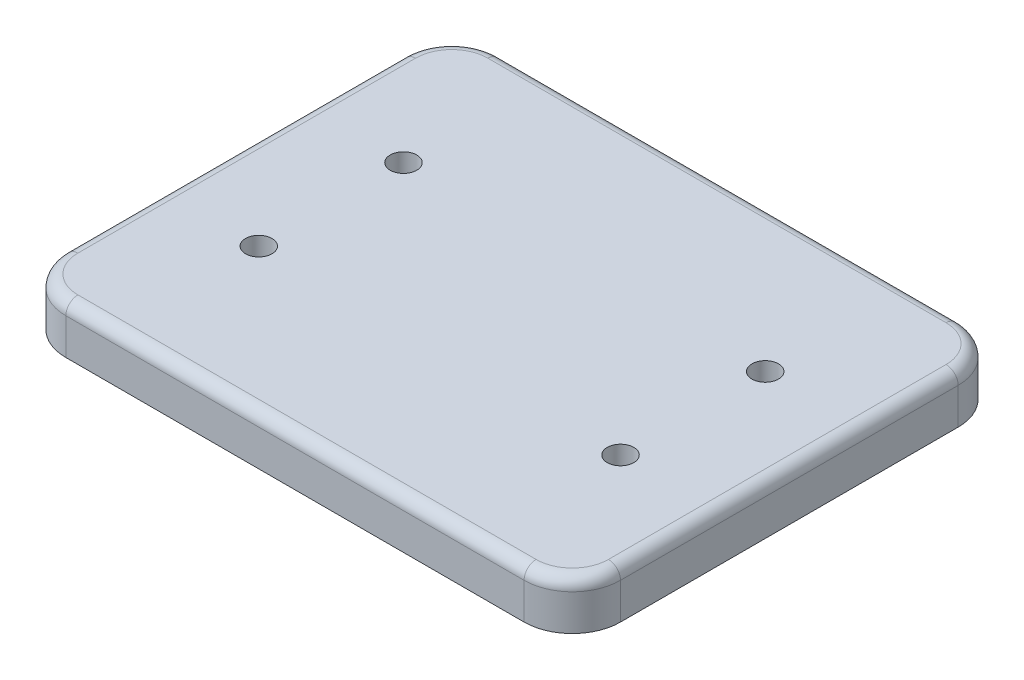
ISO-10303-21;
HEADER;
FILE_DESCRIPTION(('STEP AP214'),'2;1');
FILE_NAME('part.step','',(''),(''),'','','');
FILE_SCHEMA(('AUTOMOTIVE_DESIGN { 1 0 10303 214 1 1 1 1 }'));
ENDSEC;
DATA;
#1=APPLICATION_CONTEXT('core data for automotive mechanical design processes');
#2=APPLICATION_PROTOCOL_DEFINITION('international standard','automotive_design',2000,#1);
#3=PRODUCT_CONTEXT('',#1,'mechanical');
#4=PRODUCT('Part','Part','',(#3));
#5=PRODUCT_RELATED_PRODUCT_CATEGORY('part','',(#4));
#6=PRODUCT_DEFINITION_FORMATION('','',#4);
#7=PRODUCT_DEFINITION_CONTEXT('part definition',#1,'design');
#8=PRODUCT_DEFINITION('design','',#6,#7);
#9=PRODUCT_DEFINITION_SHAPE('','',#8);
#10=(LENGTH_UNIT() NAMED_UNIT(*) SI_UNIT(.MILLI.,.METRE.));
#11=(NAMED_UNIT(*) PLANE_ANGLE_UNIT() SI_UNIT($,.RADIAN.));
#12=(NAMED_UNIT(*) SI_UNIT($,.STERADIAN.) SOLID_ANGLE_UNIT());
#13=UNCERTAINTY_MEASURE_WITH_UNIT(LENGTH_MEASURE(1.E-05),#10,'distance_accuracy_value','');
#14=(GEOMETRIC_REPRESENTATION_CONTEXT(3) GLOBAL_UNCERTAINTY_ASSIGNED_CONTEXT((#13)) GLOBAL_UNIT_ASSIGNED_CONTEXT((#10,
#11,#12)) REPRESENTATION_CONTEXT('',''));
#15=CARTESIAN_POINT('',(0.,0.,0.));
#16=DIRECTION('',(0.,0.,1.));
#17=DIRECTION('',(1.,0.,0.));
#18=AXIS2_PLACEMENT_3D('',#15,#16,#17);
#19=CARTESIAN_POINT('',(75.,0.,30.));
#20=DIRECTION('',(0.,1.,0.));
#21=DIRECTION('',(0.,0.,1.));
#22=AXIS2_PLACEMENT_3D('',#19,#20,#21);
#23=CYLINDRICAL_SURFACE('',#22,5.5);
#24=CARTESIAN_POINT('',(75.,20.,30.));
#25=DIRECTION('',(0.,-1.,0.));
#26=DIRECTION('',(0.,0.,-1.));
#27=AXIS2_PLACEMENT_3D('',#24,#25,#26);
#28=CIRCLE('',#27,5.5);
#29=CARTESIAN_POINT('',(75.,20.,24.5));
#30=VERTEX_POINT('',#29);
#31=EDGE_CURVE('E241',#30,#30,#28,.T.);
#32=ORIENTED_EDGE('',*,*,#31,.F.);
#33=EDGE_LOOP('',(#32));
#34=FACE_BOUND('',#33,.T.);
#35=CARTESIAN_POINT('',(75.,11.,30.));
#36=DIRECTION('',(0.,-1.,0.));
#37=DIRECTION('',(0.,0.,-1.));
#38=AXIS2_PLACEMENT_3D('',#35,#36,#37);
#39=CIRCLE('',#38,5.5);
#40=CARTESIAN_POINT('',(75.,11.,24.5));
#41=VERTEX_POINT('',#40);
#42=EDGE_CURVE('E37',#41,#41,#39,.T.);
#43=ORIENTED_EDGE('',*,*,#42,.T.);
#44=EDGE_LOOP('',(#43));
#45=FACE_BOUND('',#44,.T.);
#46=ADVANCED_FACE('F33',(#34,#45),#23,.F.);
#47=CARTESIAN_POINT('',(-75.,0.,30.));
#48=DIRECTION('',(0.,1.,0.));
#49=DIRECTION('',(0.,0.,1.));
#50=AXIS2_PLACEMENT_3D('',#47,#48,#49);
#51=CYLINDRICAL_SURFACE('',#50,5.5);
#52=CARTESIAN_POINT('',(-75.,20.,30.));
#53=DIRECTION('',(0.,-1.,0.));
#54=DIRECTION('',(0.,0.,-1.));
#55=AXIS2_PLACEMENT_3D('',#52,#53,#54);
#56=CIRCLE('',#55,5.5);
#57=CARTESIAN_POINT('',(-75.,20.,24.5));
#58=VERTEX_POINT('',#57);
#59=EDGE_CURVE('E256',#58,#58,#56,.T.);
#60=ORIENTED_EDGE('',*,*,#59,.F.);
#61=EDGE_LOOP('',(#60));
#62=FACE_BOUND('',#61,.T.);
#63=CARTESIAN_POINT('',(-75.,11.,30.));
#64=DIRECTION('',(0.,-1.,0.));
#65=DIRECTION('',(0.,0.,-1.));
#66=AXIS2_PLACEMENT_3D('',#63,#64,#65);
#67=CIRCLE('',#66,5.5);
#68=CARTESIAN_POINT('',(-75.,11.,24.5));
#69=VERTEX_POINT('',#68);
#70=EDGE_CURVE('E235',#69,#69,#67,.T.);
#71=ORIENTED_EDGE('',*,*,#70,.T.);
#72=EDGE_LOOP('',(#71));
#73=FACE_BOUND('',#72,.T.);
#74=ADVANCED_FACE('F345',(#62,#73),#51,.F.);
#75=CARTESIAN_POINT('',(75.,0.,-30.));
#76=DIRECTION('',(0.,1.,0.));
#77=DIRECTION('',(0.,0.,1.));
#78=AXIS2_PLACEMENT_3D('',#75,#76,#77);
#79=CYLINDRICAL_SURFACE('',#78,5.5);
#80=CARTESIAN_POINT('',(75.,20.,-30.));
#81=DIRECTION('',(0.,1.,0.));
#82=DIRECTION('',(0.,0.,1.));
#83=AXIS2_PLACEMENT_3D('',#80,#81,#82);
#84=CIRCLE('',#83,5.5);
#85=CARTESIAN_POINT('',(75.,20.,-24.5));
#86=VERTEX_POINT('',#85);
#87=EDGE_CURVE('E151',#86,#86,#84,.T.);
#88=ORIENTED_EDGE('',*,*,#87,.T.);
#89=EDGE_LOOP('',(#88));
#90=FACE_BOUND('',#89,.T.);
#91=CARTESIAN_POINT('',(75.,11.,-30.));
#92=DIRECTION('',(0.,-1.,0.));
#93=DIRECTION('',(0.,0.,-1.));
#94=AXIS2_PLACEMENT_3D('',#91,#92,#93);
#95=CIRCLE('',#94,5.5);
#96=CARTESIAN_POINT('',(75.,11.,-35.5));
#97=VERTEX_POINT('',#96);
#98=EDGE_CURVE('E232',#97,#97,#95,.F.);
#99=ORIENTED_EDGE('',*,*,#98,.F.);
#100=EDGE_LOOP('',(#99));
#101=FACE_BOUND('',#100,.T.);
#102=ADVANCED_FACE('F277',(#90,#101),#79,.F.);
#103=CARTESIAN_POINT('',(-75.,0.,-30.));
#104=DIRECTION('',(0.,1.,0.));
#105=DIRECTION('',(0.,0.,1.));
#106=AXIS2_PLACEMENT_3D('',#103,#104,#105);
#107=CYLINDRICAL_SURFACE('',#106,5.5);
#108=CARTESIAN_POINT('',(-75.,20.,-30.));
#109=DIRECTION('',(0.,1.,0.));
#110=DIRECTION('',(0.,0.,1.));
#111=AXIS2_PLACEMENT_3D('',#108,#109,#110);
#112=CIRCLE('',#111,5.5);
#113=CARTESIAN_POINT('',(-75.,20.,-24.5));
#114=VERTEX_POINT('',#113);
#115=EDGE_CURVE('E213',#114,#114,#112,.T.);
#116=ORIENTED_EDGE('',*,*,#115,.T.);
#117=EDGE_LOOP('',(#116));
#118=FACE_BOUND('',#117,.T.);
#119=CARTESIAN_POINT('',(-75.,11.,-30.));
#120=DIRECTION('',(0.,-1.,0.));
#121=DIRECTION('',(0.,0.,-1.));
#122=AXIS2_PLACEMENT_3D('',#119,#120,#121);
#123=CIRCLE('',#122,5.5);
#124=CARTESIAN_POINT('',(-75.,11.,-35.5));
#125=VERTEX_POINT('',#124);
#126=EDGE_CURVE('E229',#125,#125,#123,.F.);
#127=ORIENTED_EDGE('',*,*,#126,.F.);
#128=EDGE_LOOP('',(#127));
#129=FACE_BOUND('',#128,.T.);
#130=ADVANCED_FACE('F374',(#118,#129),#107,.F.);
#131=CARTESIAN_POINT('',(-94.9999999999999,20.,70.));
#132=DIRECTION('',(0.,-1.,0.));
#133=DIRECTION('',(0.,0.,-1.));
#134=AXIS2_PLACEMENT_3D('',#131,#132,#133);
#135=CYLINDRICAL_SURFACE('',#134,20.);
#136=DIRECTION('',(0.,-1.,0.));
#137=VECTOR('',#136,1.);
#138=CARTESIAN_POINT('',(-94.9999999999998,20.,90.));
#139=LINE('',#138,#137);
#140=CARTESIAN_POINT('',(-94.9999999999998,15.,90.));
#141=VERTEX_POINT('',#140);
#142=CARTESIAN_POINT('',(-94.9999999999998,0.,90.));
#143=VERTEX_POINT('',#142);
#144=EDGE_CURVE('E121',#141,#143,#139,.T.);
#145=ORIENTED_EDGE('',*,*,#144,.F.);
#146=CARTESIAN_POINT('',(-94.9999999999999,15.,70.));
#147=DIRECTION('',(0.,-1.,0.));
#148=DIRECTION('',(0.,0.,-1.));
#149=AXIS2_PLACEMENT_3D('',#146,#147,#148);
#150=CIRCLE('',#149,20.);
#151=CARTESIAN_POINT('',(-115.,15.,69.9999999999999));
#152=VERTEX_POINT('',#151);
#153=EDGE_CURVE('E11',#141,#152,#150,.T.);
#154=ORIENTED_EDGE('',*,*,#153,.T.);
#155=DIRECTION('',(0.,-1.,0.));
#156=VECTOR('',#155,1.);
#157=CARTESIAN_POINT('',(-115.,20.,69.9999999999999));
#158=LINE('',#157,#156);
#159=CARTESIAN_POINT('',(-115.,0.,69.9999999999999));
#160=VERTEX_POINT('',#159);
#161=EDGE_CURVE('E143',#152,#160,#158,.T.);
#162=ORIENTED_EDGE('',*,*,#161,.T.);
#163=CARTESIAN_POINT('',(-94.9999999999999,0.,70.));
#164=DIRECTION('',(0.,1.,0.));
#165=DIRECTION('',(0.,0.,-1.));
#166=AXIS2_PLACEMENT_3D('',#163,#164,#165);
#167=CIRCLE('',#166,20.);
#168=EDGE_CURVE('E136',#160,#143,#167,.T.);
#169=ORIENTED_EDGE('',*,*,#168,.T.);
#170=EDGE_LOOP('',(#145,#154,#162,#169));
#171=FACE_BOUND('',#170,.T.);
#172=ADVANCED_FACE('F141',(#171),#135,.T.);
#173=CARTESIAN_POINT('',(94.9999999999999,20.,90.));
#174=DIRECTION('',(0.,0.,-1.));
#175=DIRECTION('',(-1.,0.,0.));
#176=AXIS2_PLACEMENT_3D('',#173,#174,#175);
#177=PLANE('',#176);
#178=DIRECTION('',(0.,-1.,0.));
#179=VECTOR('',#178,1.);
#180=CARTESIAN_POINT('',(94.9999999999999,20.,90.));
#181=LINE('',#180,#179);
#182=CARTESIAN_POINT('',(94.9999999999999,15.,90.));
#183=VERTEX_POINT('',#182);
#184=CARTESIAN_POINT('',(94.9999999999999,0.,90.));
#185=VERTEX_POINT('',#184);
#186=EDGE_CURVE('E130',#183,#185,#181,.T.);
#187=ORIENTED_EDGE('',*,*,#186,.F.);
#188=DIRECTION('',(1.,0.,0.));
#189=VECTOR('',#188,1.);
#190=CARTESIAN_POINT('',(94.9999999999999,15.,90.));
#191=LINE('',#190,#189);
#192=EDGE_CURVE('E42',#183,#141,#191,.F.);
#193=ORIENTED_EDGE('',*,*,#192,.T.);
#194=ORIENTED_EDGE('',*,*,#144,.T.);
#195=DIRECTION('',(1.,0.,0.));
#196=VECTOR('',#195,1.);
#197=CARTESIAN_POINT('',(94.9999999999999,0.,90.));
#198=LINE('',#197,#196);
#199=EDGE_CURVE('E124',#143,#185,#198,.T.);
#200=ORIENTED_EDGE('',*,*,#199,.T.);
#201=EDGE_LOOP('',(#187,#193,#194,#200));
#202=FACE_BOUND('',#201,.T.);
#203=ADVANCED_FACE('F123',(#202),#177,.F.);
#204=CARTESIAN_POINT('',(95.0000000000001,20.,70.));
#205=DIRECTION('',(0.,-1.,0.));
#206=DIRECTION('',(0.,0.,-1.));
#207=AXIS2_PLACEMENT_3D('',#204,#205,#206);
#208=CYLINDRICAL_SURFACE('',#207,20.);
#209=DIRECTION('',(0.,-1.,0.));
#210=VECTOR('',#209,1.);
#211=CARTESIAN_POINT('',(115.,20.,69.9999999999999));
#212=LINE('',#211,#210);
#213=CARTESIAN_POINT('',(115.,15.,69.9999999999999));
#214=VERTEX_POINT('',#213);
#215=CARTESIAN_POINT('',(115.,0.,69.9999999999999));
#216=VERTEX_POINT('',#215);
#217=EDGE_CURVE('E178',#214,#216,#212,.T.);
#218=ORIENTED_EDGE('',*,*,#217,.F.);
#219=CARTESIAN_POINT('',(95.0000000000001,15.,70.));
#220=DIRECTION('',(0.,-1.,0.));
#221=DIRECTION('',(0.,0.,-1.));
#222=AXIS2_PLACEMENT_3D('',#219,#220,#221);
#223=CIRCLE('',#222,20.);
#224=EDGE_CURVE('E57',#214,#183,#223,.T.);
#225=ORIENTED_EDGE('',*,*,#224,.T.);
#226=ORIENTED_EDGE('',*,*,#186,.T.);
#227=CARTESIAN_POINT('',(95.0000000000001,0.,70.));
#228=DIRECTION('',(0.,1.,0.));
#229=DIRECTION('',(0.,0.,1.));
#230=AXIS2_PLACEMENT_3D('',#227,#228,#229);
#231=CIRCLE('',#230,20.);
#232=EDGE_CURVE('E139',#185,#216,#231,.T.);
#233=ORIENTED_EDGE('',*,*,#232,.T.);
#234=EDGE_LOOP('',(#218,#225,#226,#233));
#235=FACE_BOUND('',#234,.T.);
#236=ADVANCED_FACE('F562',(#235),#208,.T.);
#237=CARTESIAN_POINT('',(115.,20.,69.9999999999999));
#238=DIRECTION('',(-1.,0.,0.));
#239=DIRECTION('',(0.,0.,1.));
#240=AXIS2_PLACEMENT_3D('',#237,#238,#239);
#241=PLANE('',#240);
#242=DIRECTION('',(0.,-1.,0.));
#243=VECTOR('',#242,1.);
#244=CARTESIAN_POINT('',(115.,20.,-69.9999999999999));
#245=LINE('',#244,#243);
#246=CARTESIAN_POINT('',(115.,15.,-69.9999999999999));
#247=VERTEX_POINT('',#246);
#248=CARTESIAN_POINT('',(115.,0.,-69.9999999999999));
#249=VERTEX_POINT('',#248);
#250=EDGE_CURVE('E176',#247,#249,#245,.T.);
#251=ORIENTED_EDGE('',*,*,#250,.F.);
#252=DIRECTION('',(0.,0.,-1.));
#253=VECTOR('',#252,1.);
#254=CARTESIAN_POINT('',(115.,15.,69.9999999999999));
#255=LINE('',#254,#253);
#256=EDGE_CURVE('E206',#247,#214,#255,.F.);
#257=ORIENTED_EDGE('',*,*,#256,.T.);
#258=ORIENTED_EDGE('',*,*,#217,.T.);
#259=DIRECTION('',(0.,0.,-1.));
#260=VECTOR('',#259,1.);
#261=CARTESIAN_POINT('',(115.,0.,69.9999999999999));
#262=LINE('',#261,#260);
#263=EDGE_CURVE('E155',#216,#249,#262,.T.);
#264=ORIENTED_EDGE('',*,*,#263,.T.);
#265=EDGE_LOOP('',(#251,#257,#258,#264));
#266=FACE_BOUND('',#265,.T.);
#267=ADVANCED_FACE('F554',(#266),#241,.F.);
#268=CARTESIAN_POINT('',(95.0000000000001,20.,-70.));
#269=DIRECTION('',(0.,-1.,0.));
#270=DIRECTION('',(0.,0.,-1.));
#271=AXIS2_PLACEMENT_3D('',#268,#269,#270);
#272=CYLINDRICAL_SURFACE('',#271,20.);
#273=DIRECTION('',(0.,-1.,0.));
#274=VECTOR('',#273,1.);
#275=CARTESIAN_POINT('',(94.9999999999999,20.,-90.));
#276=LINE('',#275,#274);
#277=CARTESIAN_POINT('',(94.9999999999999,15.,-90.));
#278=VERTEX_POINT('',#277);
#279=CARTESIAN_POINT('',(94.9999999999999,0.,-90.));
#280=VERTEX_POINT('',#279);
#281=EDGE_CURVE('E174',#278,#280,#276,.T.);
#282=ORIENTED_EDGE('',*,*,#281,.F.);
#283=CARTESIAN_POINT('',(95.0000000000001,15.,-70.));
#284=DIRECTION('',(0.,-1.,0.));
#285=DIRECTION('',(0.,0.,-1.));
#286=AXIS2_PLACEMENT_3D('',#283,#284,#285);
#287=CIRCLE('',#286,20.);
#288=EDGE_CURVE('E204',#278,#247,#287,.T.);
#289=ORIENTED_EDGE('',*,*,#288,.T.);
#290=ORIENTED_EDGE('',*,*,#250,.T.);
#291=CARTESIAN_POINT('',(95.0000000000001,0.,-70.));
#292=DIRECTION('',(0.,1.,0.));
#293=DIRECTION('',(0.,0.,1.));
#294=AXIS2_PLACEMENT_3D('',#291,#292,#293);
#295=CIRCLE('',#294,20.);
#296=EDGE_CURVE('E158',#249,#280,#295,.T.);
#297=ORIENTED_EDGE('',*,*,#296,.T.);
#298=EDGE_LOOP('',(#282,#289,#290,#297));
#299=FACE_BOUND('',#298,.T.);
#300=ADVANCED_FACE('F327',(#299),#272,.T.);
#301=CARTESIAN_POINT('',(94.9999999999999,20.,-90.));
#302=DIRECTION('',(0.,0.,1.));
#303=DIRECTION('',(1.,0.,0.));
#304=AXIS2_PLACEMENT_3D('',#301,#302,#303);
#305=PLANE('',#304);
#306=DIRECTION('',(0.,-1.,0.));
#307=VECTOR('',#306,1.);
#308=CARTESIAN_POINT('',(-94.9999999999998,20.,-90.));
#309=LINE('',#308,#307);
#310=CARTESIAN_POINT('',(-94.9999999999998,15.,-90.));
#311=VERTEX_POINT('',#310);
#312=CARTESIAN_POINT('',(-94.9999999999998,0.,-90.));
#313=VERTEX_POINT('',#312);
#314=EDGE_CURVE('E172',#311,#313,#309,.T.);
#315=ORIENTED_EDGE('',*,*,#314,.F.);
#316=DIRECTION('',(-1.,0.,0.));
#317=VECTOR('',#316,1.);
#318=CARTESIAN_POINT('',(94.9999999999999,15.,-90.));
#319=LINE('',#318,#317);
#320=EDGE_CURVE('E202',#311,#278,#319,.F.);
#321=ORIENTED_EDGE('',*,*,#320,.T.);
#322=ORIENTED_EDGE('',*,*,#281,.T.);
#323=DIRECTION('',(-1.,0.,0.));
#324=VECTOR('',#323,1.);
#325=CARTESIAN_POINT('',(94.9999999999999,0.,-90.));
#326=LINE('',#325,#324);
#327=EDGE_CURVE('E161',#280,#313,#326,.T.);
#328=ORIENTED_EDGE('',*,*,#327,.T.);
#329=EDGE_LOOP('',(#315,#321,#322,#328));
#330=FACE_BOUND('',#329,.T.);
#331=ADVANCED_FACE('F325',(#330),#305,.F.);
#332=CARTESIAN_POINT('',(-94.9999999999999,20.,-70.));
#333=DIRECTION('',(0.,-1.,0.));
#334=DIRECTION('',(0.,0.,-1.));
#335=AXIS2_PLACEMENT_3D('',#332,#333,#334);
#336=CYLINDRICAL_SURFACE('',#335,20.);
#337=DIRECTION('',(0.,-1.,0.));
#338=VECTOR('',#337,1.);
#339=CARTESIAN_POINT('',(-115.,20.,-69.9999999999998));
#340=LINE('',#339,#338);
#341=CARTESIAN_POINT('',(-115.,15.,-69.9999999999998));
#342=VERTEX_POINT('',#341);
#343=CARTESIAN_POINT('',(-115.,0.,-69.9999999999998));
#344=VERTEX_POINT('',#343);
#345=EDGE_CURVE('E170',#342,#344,#340,.T.);
#346=ORIENTED_EDGE('',*,*,#345,.F.);
#347=CARTESIAN_POINT('',(-94.9999999999999,15.,-70.));
#348=DIRECTION('',(0.,-1.,0.));
#349=DIRECTION('',(0.,0.,-1.));
#350=AXIS2_PLACEMENT_3D('',#347,#348,#349);
#351=CIRCLE('',#350,20.);
#352=EDGE_CURVE('E200',#342,#311,#351,.T.);
#353=ORIENTED_EDGE('',*,*,#352,.T.);
#354=ORIENTED_EDGE('',*,*,#314,.T.);
#355=CARTESIAN_POINT('',(-94.9999999999999,0.,-70.));
#356=DIRECTION('',(0.,1.,0.));
#357=DIRECTION('',(0.,0.,1.));
#358=AXIS2_PLACEMENT_3D('',#355,#356,#357);
#359=CIRCLE('',#358,20.);
#360=EDGE_CURVE('E164',#313,#344,#359,.T.);
#361=ORIENTED_EDGE('',*,*,#360,.T.);
#362=EDGE_LOOP('',(#346,#353,#354,#361));
#363=FACE_BOUND('',#362,.T.);
#364=ADVANCED_FACE('F334',(#363),#336,.T.);
#365=CARTESIAN_POINT('',(-115.,20.,69.9999999999999));
#366=DIRECTION('',(1.,0.,0.));
#367=DIRECTION('',(0.,0.,-1.));
#368=AXIS2_PLACEMENT_3D('',#365,#366,#367);
#369=PLANE('',#368);
#370=ORIENTED_EDGE('',*,*,#161,.F.);
#371=DIRECTION('',(0.,0.,1.));
#372=VECTOR('',#371,1.);
#373=CARTESIAN_POINT('',(-115.,15.,69.9999999999999));
#374=LINE('',#373,#372);
#375=EDGE_CURVE('E197',#152,#342,#374,.F.);
#376=ORIENTED_EDGE('',*,*,#375,.T.);
#377=ORIENTED_EDGE('',*,*,#345,.T.);
#378=DIRECTION('',(0.,0.,1.));
#379=VECTOR('',#378,1.);
#380=CARTESIAN_POINT('',(-115.,0.,69.9999999999999));
#381=LINE('',#380,#379);
#382=EDGE_CURVE('E167',#344,#160,#381,.T.);
#383=ORIENTED_EDGE('',*,*,#382,.T.);
#384=EDGE_LOOP('',(#370,#376,#377,#383));
#385=FACE_BOUND('',#384,.T.);
#386=ADVANCED_FACE('F283',(#385),#369,.F.);
#387=CARTESIAN_POINT('',(-94.9999999999999,20.,70.));
#388=DIRECTION('',(0.,-1.,0.));
#389=DIRECTION('',(0.,0.,-1.));
#390=AXIS2_PLACEMENT_3D('',#387,#388,#389);
#391=PLANE('',#390);
#392=ORIENTED_EDGE('',*,*,#59,.T.);
#393=EDGE_LOOP('',(#392));
#394=FACE_BOUND('',#393,.T.);
#395=ORIENTED_EDGE('',*,*,#31,.T.);
#396=EDGE_LOOP('',(#395));
#397=FACE_BOUND('',#396,.T.);
#398=ORIENTED_EDGE('',*,*,#115,.F.);
#399=EDGE_LOOP('',(#398));
#400=FACE_BOUND('',#399,.T.);
#401=ORIENTED_EDGE('',*,*,#87,.F.);
#402=EDGE_LOOP('',(#401));
#403=FACE_BOUND('',#402,.T.);
#404=CARTESIAN_POINT('',(-94.9999999999999,20.,-70.));
#405=DIRECTION('',(0.,-1.,0.));
#406=DIRECTION('',(0.,0.,-1.));
#407=AXIS2_PLACEMENT_3D('',#404,#405,#406);
#408=CIRCLE('',#407,15.);
#409=CARTESIAN_POINT('',(-94.9999999999998,20.,-85.));
#410=VERTEX_POINT('',#409);
#411=CARTESIAN_POINT('',(-110.,20.,-69.9999999999998));
#412=VERTEX_POINT('',#411);
#413=EDGE_CURVE('E192',#410,#412,#408,.F.);
#414=ORIENTED_EDGE('',*,*,#413,.T.);
#415=DIRECTION('',(0.,0.,1.));
#416=VECTOR('',#415,1.);
#417=CARTESIAN_POINT('',(-110.,20.,70.));
#418=LINE('',#417,#416);
#419=CARTESIAN_POINT('',(-110.,20.,69.9999999999999));
#420=VERTEX_POINT('',#419);
#421=EDGE_CURVE('E194',#412,#420,#418,.T.);
#422=ORIENTED_EDGE('',*,*,#421,.T.);
#423=CARTESIAN_POINT('',(-94.9999999999999,20.,70.));
#424=DIRECTION('',(0.,-1.,0.));
#425=DIRECTION('',(0.,0.,-1.));
#426=AXIS2_PLACEMENT_3D('',#423,#424,#425);
#427=CIRCLE('',#426,15.);
#428=CARTESIAN_POINT('',(-94.9999999999998,20.,85.));
#429=VERTEX_POINT('',#428);
#430=EDGE_CURVE('E129',#420,#429,#427,.F.);
#431=ORIENTED_EDGE('',*,*,#430,.T.);
#432=DIRECTION('',(1.,0.,0.));
#433=VECTOR('',#432,1.);
#434=CARTESIAN_POINT('',(-94.9999999999999,20.,85.));
#435=LINE('',#434,#433);
#436=CARTESIAN_POINT('',(95.,20.,85.));
#437=VERTEX_POINT('',#436);
#438=EDGE_CURVE('E182',#429,#437,#435,.T.);
#439=ORIENTED_EDGE('',*,*,#438,.T.);
#440=CARTESIAN_POINT('',(95.0000000000001,20.,70.));
#441=DIRECTION('',(0.,-1.,0.));
#442=DIRECTION('',(0.,0.,-1.));
#443=AXIS2_PLACEMENT_3D('',#440,#441,#442);
#444=CIRCLE('',#443,15.);
#445=CARTESIAN_POINT('',(110.,20.,69.9999999999999));
#446=VERTEX_POINT('',#445);
#447=EDGE_CURVE('E184',#437,#446,#444,.F.);
#448=ORIENTED_EDGE('',*,*,#447,.T.);
#449=DIRECTION('',(0.,0.,-1.));
#450=VECTOR('',#449,1.);
#451=CARTESIAN_POINT('',(110.,20.,70.));
#452=LINE('',#451,#450);
#453=CARTESIAN_POINT('',(110.,20.,-69.9999999999999));
#454=VERTEX_POINT('',#453);
#455=EDGE_CURVE('E186',#446,#454,#452,.T.);
#456=ORIENTED_EDGE('',*,*,#455,.T.);
#457=CARTESIAN_POINT('',(95.0000000000001,20.,-70.));
#458=DIRECTION('',(0.,-1.,0.));
#459=DIRECTION('',(0.,0.,-1.));
#460=AXIS2_PLACEMENT_3D('',#457,#458,#459);
#461=CIRCLE('',#460,15.);
#462=CARTESIAN_POINT('',(94.9999999999999,20.,-85.));
#463=VERTEX_POINT('',#462);
#464=EDGE_CURVE('E188',#454,#463,#461,.F.);
#465=ORIENTED_EDGE('',*,*,#464,.T.);
#466=DIRECTION('',(-1.,0.,0.));
#467=VECTOR('',#466,1.);
#468=CARTESIAN_POINT('',(-95.,20.,-85.));
#469=LINE('',#468,#467);
#470=EDGE_CURVE('E190',#463,#410,#469,.T.);
#471=ORIENTED_EDGE('',*,*,#470,.T.);
#472=EDGE_LOOP('',(#414,#422,#431,#439,#448,#456,#465,#471));
#473=FACE_BOUND('',#472,.T.);
#474=ADVANCED_FACE('F280',(#394,#397,#400,#403,#473),#391,.F.);
#475=CARTESIAN_POINT('',(-94.9999999999999,0.,70.));
#476=DIRECTION('',(0.,-1.,0.));
#477=DIRECTION('',(0.,0.,-1.));
#478=AXIS2_PLACEMENT_3D('',#475,#476,#477);
#479=PLANE('',#478);
#480=CARTESIAN_POINT('',(-75.,0.,30.));
#481=DIRECTION('',(0.,1.,0.));
#482=DIRECTION('',(0.,0.,1.));
#483=AXIS2_PLACEMENT_3D('',#480,#481,#482);
#484=CIRCLE('',#483,9.);
#485=CARTESIAN_POINT('',(-75.,0.,39.));
#486=VERTEX_POINT('',#485);
#487=EDGE_CURVE('E243',#486,#486,#484,.T.);
#488=ORIENTED_EDGE('',*,*,#487,.T.);
#489=EDGE_LOOP('',(#488));
#490=FACE_BOUND('',#489,.T.);
#491=CARTESIAN_POINT('',(75.,0.,30.));
#492=DIRECTION('',(0.,1.,0.));
#493=DIRECTION('',(0.,0.,1.));
#494=AXIS2_PLACEMENT_3D('',#491,#492,#493);
#495=CIRCLE('',#494,9.);
#496=CARTESIAN_POINT('',(75.,0.,39.));
#497=VERTEX_POINT('',#496);
#498=EDGE_CURVE('E253',#497,#497,#495,.T.);
#499=ORIENTED_EDGE('',*,*,#498,.T.);
#500=EDGE_LOOP('',(#499));
#501=FACE_BOUND('',#500,.T.);
#502=CARTESIAN_POINT('',(-75.,0.,-30.));
#503=DIRECTION('',(0.,-1.,0.));
#504=DIRECTION('',(0.,0.,-1.));
#505=AXIS2_PLACEMENT_3D('',#502,#503,#504);
#506=CIRCLE('',#505,9.);
#507=CARTESIAN_POINT('',(-75.,0.,-39.));
#508=VERTEX_POINT('',#507);
#509=EDGE_CURVE('E264',#508,#508,#506,.T.);
#510=ORIENTED_EDGE('',*,*,#509,.F.);
#511=EDGE_LOOP('',(#510));
#512=FACE_BOUND('',#511,.T.);
#513=CARTESIAN_POINT('',(75.,0.,-30.));
#514=DIRECTION('',(0.,-1.,0.));
#515=DIRECTION('',(0.,0.,-1.));
#516=AXIS2_PLACEMENT_3D('',#513,#514,#515);
#517=CIRCLE('',#516,9.);
#518=CARTESIAN_POINT('',(75.,0.,-39.));
#519=VERTEX_POINT('',#518);
#520=EDGE_CURVE('E259',#519,#519,#517,.T.);
#521=ORIENTED_EDGE('',*,*,#520,.F.);
#522=EDGE_LOOP('',(#521));
#523=FACE_BOUND('',#522,.T.);
#524=ORIENTED_EDGE('',*,*,#168,.F.);
#525=ORIENTED_EDGE('',*,*,#382,.F.);
#526=ORIENTED_EDGE('',*,*,#360,.F.);
#527=ORIENTED_EDGE('',*,*,#327,.F.);
#528=ORIENTED_EDGE('',*,*,#296,.F.);
#529=ORIENTED_EDGE('',*,*,#263,.F.);
#530=ORIENTED_EDGE('',*,*,#232,.F.);
#531=ORIENTED_EDGE('',*,*,#199,.F.);
#532=EDGE_LOOP('',(#524,#525,#526,#527,#528,#529,#530,#531));
#533=FACE_BOUND('',#532,.T.);
#534=ADVANCED_FACE('F134',(#490,#501,#512,#523,#533),#479,.T.);
#535=CARTESIAN_POINT('',(110.,15.,70.));
#536=DIRECTION('',(0.,0.,-1.));
#537=DIRECTION('',(-1.,0.,0.));
#538=AXIS2_PLACEMENT_3D('',#535,#536,#537);
#539=CYLINDRICAL_SURFACE('',#538,5.);
#540=CARTESIAN_POINT('',(110.,15.,69.9999999999999));
#541=DIRECTION('',(0.,0.,1.));
#542=DIRECTION('',(1.,0.,0.));
#543=AXIS2_PLACEMENT_3D('',#540,#541,#542);
#544=CIRCLE('',#543,5.);
#545=EDGE_CURVE('E148',#214,#446,#544,.T.);
#546=ORIENTED_EDGE('',*,*,#545,.F.);
#547=ORIENTED_EDGE('',*,*,#256,.F.);
#548=CARTESIAN_POINT('',(110.,15.,-69.9999999999999));
#549=DIRECTION('',(0.,0.,-1.));
#550=DIRECTION('',(-1.,0.,0.));
#551=AXIS2_PLACEMENT_3D('',#548,#549,#550);
#552=CIRCLE('',#551,5.);
#553=EDGE_CURVE('E145',#454,#247,#552,.T.);
#554=ORIENTED_EDGE('',*,*,#553,.F.);
#555=ORIENTED_EDGE('',*,*,#455,.F.);
#556=EDGE_LOOP('',(#546,#547,#554,#555));
#557=FACE_BOUND('',#556,.T.);
#558=ADVANCED_FACE('F35',(#557),#539,.T.);
#559=CARTESIAN_POINT('',(95.0000000000001,15.,-70.));
#560=DIRECTION('',(0.,-1.,0.));
#561=DIRECTION('',(0.,0.,-1.));
#562=AXIS2_PLACEMENT_3D('',#559,#560,#561);
#563=TOROIDAL_SURFACE('',#562,15.,5.);
#564=ORIENTED_EDGE('',*,*,#553,.T.);
#565=ORIENTED_EDGE('',*,*,#288,.F.);
#566=CARTESIAN_POINT('',(94.9999999999999,15.,-85.));
#567=DIRECTION('',(-1.,0.,0.));
#568=DIRECTION('',(0.,0.,1.));
#569=AXIS2_PLACEMENT_3D('',#566,#567,#568);
#570=CIRCLE('',#569,5.);
#571=EDGE_CURVE('E224',#463,#278,#570,.T.);
#572=ORIENTED_EDGE('',*,*,#571,.F.);
#573=ORIENTED_EDGE('',*,*,#464,.F.);
#574=EDGE_LOOP('',(#564,#565,#572,#573));
#575=FACE_BOUND('',#574,.T.);
#576=ADVANCED_FACE('F318',(#575),#563,.T.);
#577=CARTESIAN_POINT('',(95.0000000000001,15.,70.));
#578=DIRECTION('',(0.,-1.,0.));
#579=DIRECTION('',(0.,0.,-1.));
#580=AXIS2_PLACEMENT_3D('',#577,#578,#579);
#581=TOROIDAL_SURFACE('',#580,15.,5.);
#582=ORIENTED_EDGE('',*,*,#545,.T.);
#583=ORIENTED_EDGE('',*,*,#447,.F.);
#584=CARTESIAN_POINT('',(95.,15.,85.));
#585=DIRECTION('',(-1.,0.,0.));
#586=DIRECTION('',(0.,0.,1.));
#587=AXIS2_PLACEMENT_3D('',#584,#585,#586);
#588=CIRCLE('',#587,5.);
#589=EDGE_CURVE('E221',#183,#437,#588,.T.);
#590=ORIENTED_EDGE('',*,*,#589,.F.);
#591=ORIENTED_EDGE('',*,*,#224,.F.);
#592=EDGE_LOOP('',(#582,#583,#590,#591));
#593=FACE_BOUND('',#592,.T.);
#594=ADVANCED_FACE('F308',(#593),#581,.T.);
#595=CARTESIAN_POINT('',(-95.,15.,-85.));
#596=DIRECTION('',(-1.,0.,0.));
#597=DIRECTION('',(0.,0.,1.));
#598=AXIS2_PLACEMENT_3D('',#595,#596,#597);
#599=CYLINDRICAL_SURFACE('',#598,5.);
#600=ORIENTED_EDGE('',*,*,#571,.T.);
#601=ORIENTED_EDGE('',*,*,#320,.F.);
#602=CARTESIAN_POINT('',(-94.9999999999998,15.,-85.));
#603=DIRECTION('',(-1.,0.,0.));
#604=DIRECTION('',(0.,0.,1.));
#605=AXIS2_PLACEMENT_3D('',#602,#603,#604);
#606=CIRCLE('',#605,5.);
#607=EDGE_CURVE('E218',#410,#311,#606,.T.);
#608=ORIENTED_EDGE('',*,*,#607,.F.);
#609=ORIENTED_EDGE('',*,*,#470,.F.);
#610=EDGE_LOOP('',(#600,#601,#608,#609));
#611=FACE_BOUND('',#610,.T.);
#612=ADVANCED_FACE('F321',(#611),#599,.T.);
#613=CARTESIAN_POINT('',(-94.9999999999999,15.,85.));
#614=DIRECTION('',(1.,0.,0.));
#615=DIRECTION('',(0.,0.,-1.));
#616=AXIS2_PLACEMENT_3D('',#613,#614,#615);
#617=CYLINDRICAL_SURFACE('',#616,5.);
#618=ORIENTED_EDGE('',*,*,#589,.T.);
#619=ORIENTED_EDGE('',*,*,#438,.F.);
#620=CARTESIAN_POINT('',(-94.9999999999998,15.,85.));
#621=DIRECTION('',(-1.,0.,0.));
#622=DIRECTION('',(0.,0.,1.));
#623=AXIS2_PLACEMENT_3D('',#620,#621,#622);
#624=CIRCLE('',#623,5.);
#625=EDGE_CURVE('E215',#141,#429,#624,.T.);
#626=ORIENTED_EDGE('',*,*,#625,.F.);
#627=ORIENTED_EDGE('',*,*,#192,.F.);
#628=EDGE_LOOP('',(#618,#619,#626,#627));
#629=FACE_BOUND('',#628,.T.);
#630=ADVANCED_FACE('F305',(#629),#617,.T.);
#631=CARTESIAN_POINT('',(-94.9999999999999,15.,-70.));
#632=DIRECTION('',(0.,-1.,0.));
#633=DIRECTION('',(0.,0.,-1.));
#634=AXIS2_PLACEMENT_3D('',#631,#632,#633);
#635=TOROIDAL_SURFACE('',#634,15.,5.);
#636=ORIENTED_EDGE('',*,*,#607,.T.);
#637=ORIENTED_EDGE('',*,*,#352,.F.);
#638=CARTESIAN_POINT('',(-110.,15.,-69.9999999999998));
#639=DIRECTION('',(0.,0.,1.));
#640=DIRECTION('',(1.,0.,0.));
#641=AXIS2_PLACEMENT_3D('',#638,#639,#640);
#642=CIRCLE('',#641,5.);
#643=EDGE_CURVE('E212',#412,#342,#642,.T.);
#644=ORIENTED_EDGE('',*,*,#643,.F.);
#645=ORIENTED_EDGE('',*,*,#413,.F.);
#646=EDGE_LOOP('',(#636,#637,#644,#645));
#647=FACE_BOUND('',#646,.T.);
#648=ADVANCED_FACE('F293',(#647),#635,.T.);
#649=CARTESIAN_POINT('',(-94.9999999999999,15.,70.));
#650=DIRECTION('',(0.,-1.,0.));
#651=DIRECTION('',(0.,0.,-1.));
#652=AXIS2_PLACEMENT_3D('',#649,#650,#651);
#653=TOROIDAL_SURFACE('',#652,15.,5.);
#654=ORIENTED_EDGE('',*,*,#625,.T.);
#655=ORIENTED_EDGE('',*,*,#430,.F.);
#656=CARTESIAN_POINT('',(-110.,15.,69.9999999999999));
#657=DIRECTION('',(0.,0.,-1.));
#658=DIRECTION('',(0.,1.,0.));
#659=AXIS2_PLACEMENT_3D('',#656,#657,#658);
#660=CIRCLE('',#659,5.);
#661=EDGE_CURVE('E210',#152,#420,#660,.T.);
#662=ORIENTED_EDGE('',*,*,#661,.F.);
#663=ORIENTED_EDGE('',*,*,#153,.F.);
#664=EDGE_LOOP('',(#654,#655,#662,#663));
#665=FACE_BOUND('',#664,.T.);
#666=ADVANCED_FACE('F301',(#665),#653,.T.);
#667=CARTESIAN_POINT('',(-110.,15.,70.));
#668=DIRECTION('',(0.,0.,1.));
#669=DIRECTION('',(1.,0.,0.));
#670=AXIS2_PLACEMENT_3D('',#667,#668,#669);
#671=CYLINDRICAL_SURFACE('',#670,5.);
#672=ORIENTED_EDGE('',*,*,#643,.T.);
#673=ORIENTED_EDGE('',*,*,#375,.F.);
#674=ORIENTED_EDGE('',*,*,#661,.T.);
#675=ORIENTED_EDGE('',*,*,#421,.F.);
#676=EDGE_LOOP('',(#672,#673,#674,#675));
#677=FACE_BOUND('',#676,.T.);
#678=ADVANCED_FACE('F296',(#677),#671,.T.);
#679=CARTESIAN_POINT('',(-75.,11.,-30.));
#680=DIRECTION('',(0.,-1.,0.));
#681=DIRECTION('',(0.,0.,-1.));
#682=AXIS2_PLACEMENT_3D('',#679,#680,#681);
#683=PLANE('',#682);
#684=CARTESIAN_POINT('',(-75.,11.,-30.));
#685=DIRECTION('',(0.,-1.,0.));
#686=DIRECTION('',(0.,0.,-1.));
#687=AXIS2_PLACEMENT_3D('',#684,#685,#686);
#688=CIRCLE('',#687,9.);
#689=CARTESIAN_POINT('',(-75.,11.,-39.));
#690=VERTEX_POINT('',#689);
#691=EDGE_CURVE('E233',#690,#690,#688,.T.);
#692=ORIENTED_EDGE('',*,*,#691,.T.);
#693=EDGE_LOOP('',(#692));
#694=FACE_BOUND('',#693,.T.);
#695=ORIENTED_EDGE('',*,*,#126,.T.);
#696=EDGE_LOOP('',(#695));
#697=FACE_BOUND('',#696,.T.);
#698=ADVANCED_FACE('F358',(#694,#697),#683,.T.);
#699=CARTESIAN_POINT('',(-75.,11.,-30.));
#700=DIRECTION('',(0.,-1.,0.));
#701=DIRECTION('',(0.,0.,-1.));
#702=AXIS2_PLACEMENT_3D('',#699,#700,#701);
#703=CYLINDRICAL_SURFACE('',#702,9.);
#704=ORIENTED_EDGE('',*,*,#691,.F.);
#705=EDGE_LOOP('',(#704));
#706=FACE_BOUND('',#705,.T.);
#707=ORIENTED_EDGE('',*,*,#509,.T.);
#708=EDGE_LOOP('',(#707));
#709=FACE_BOUND('',#708,.T.);
#710=ADVANCED_FACE('F361',(#706,#709),#703,.F.);
#711=CARTESIAN_POINT('',(75.,11.,-30.));
#712=DIRECTION('',(0.,-1.,0.));
#713=DIRECTION('',(0.,0.,-1.));
#714=AXIS2_PLACEMENT_3D('',#711,#712,#713);
#715=PLANE('',#714);
#716=CARTESIAN_POINT('',(75.,11.,-30.));
#717=DIRECTION('',(0.,-1.,0.));
#718=DIRECTION('',(0.,0.,-1.));
#719=AXIS2_PLACEMENT_3D('',#716,#717,#718);
#720=CIRCLE('',#719,9.);
#721=CARTESIAN_POINT('',(75.,11.,-39.));
#722=VERTEX_POINT('',#721);
#723=EDGE_CURVE('E267',#722,#722,#720,.T.);
#724=ORIENTED_EDGE('',*,*,#723,.T.);
#725=EDGE_LOOP('',(#724));
#726=FACE_BOUND('',#725,.T.);
#727=ORIENTED_EDGE('',*,*,#98,.T.);
#728=EDGE_LOOP('',(#727));
#729=FACE_BOUND('',#728,.T.);
#730=ADVANCED_FACE('F365',(#726,#729),#715,.T.);
#731=CARTESIAN_POINT('',(75.,11.,-30.));
#732=DIRECTION('',(0.,-1.,0.));
#733=DIRECTION('',(0.,0.,-1.));
#734=AXIS2_PLACEMENT_3D('',#731,#732,#733);
#735=CYLINDRICAL_SURFACE('',#734,9.);
#736=ORIENTED_EDGE('',*,*,#723,.F.);
#737=EDGE_LOOP('',(#736));
#738=FACE_BOUND('',#737,.T.);
#739=ORIENTED_EDGE('',*,*,#520,.T.);
#740=EDGE_LOOP('',(#739));
#741=FACE_BOUND('',#740,.T.);
#742=ADVANCED_FACE('F369',(#738,#741),#735,.F.);
#743=CARTESIAN_POINT('',(-75.,11.,30.));
#744=DIRECTION('',(0.,-1.,0.));
#745=DIRECTION('',(0.,0.,-1.));
#746=AXIS2_PLACEMENT_3D('',#743,#744,#745);
#747=CYLINDRICAL_SURFACE('',#746,9.);
#748=CARTESIAN_POINT('',(-75.,11.,30.));
#749=DIRECTION('',(0.,1.,0.));
#750=DIRECTION('',(0.,0.,1.));
#751=AXIS2_PLACEMENT_3D('',#748,#749,#750);
#752=CIRCLE('',#751,9.);
#753=CARTESIAN_POINT('',(-75.,11.,39.));
#754=VERTEX_POINT('',#753);
#755=EDGE_CURVE('E237',#754,#754,#752,.T.);
#756=ORIENTED_EDGE('',*,*,#755,.T.);
#757=EDGE_LOOP('',(#756));
#758=FACE_BOUND('',#757,.T.);
#759=ORIENTED_EDGE('',*,*,#487,.F.);
#760=EDGE_LOOP('',(#759));
#761=FACE_BOUND('',#760,.T.);
#762=ADVANCED_FACE('F372',(#758,#761),#747,.F.);
#763=CARTESIAN_POINT('',(-75.,11.,30.));
#764=DIRECTION('',(0.,-1.,0.));
#765=DIRECTION('',(0.,0.,1.));
#766=AXIS2_PLACEMENT_3D('',#763,#764,#765);
#767=PLANE('',#766);
#768=ORIENTED_EDGE('',*,*,#70,.F.);
#769=EDGE_LOOP('',(#768));
#770=FACE_BOUND('',#769,.T.);
#771=ORIENTED_EDGE('',*,*,#755,.F.);
#772=EDGE_LOOP('',(#771));
#773=FACE_BOUND('',#772,.T.);
#774=ADVANCED_FACE('F397',(#770,#773),#767,.T.);
#775=CARTESIAN_POINT('',(75.,11.,30.));
#776=DIRECTION('',(0.,-1.,0.));
#777=DIRECTION('',(0.,0.,-1.));
#778=AXIS2_PLACEMENT_3D('',#775,#776,#777);
#779=CYLINDRICAL_SURFACE('',#778,9.);
#780=CARTESIAN_POINT('',(75.,11.,30.));
#781=DIRECTION('',(0.,1.,0.));
#782=DIRECTION('',(0.,0.,1.));
#783=AXIS2_PLACEMENT_3D('',#780,#781,#782);
#784=CIRCLE('',#783,9.);
#785=CARTESIAN_POINT('',(75.,11.,39.));
#786=VERTEX_POINT('',#785);
#787=EDGE_CURVE('E248',#786,#786,#784,.T.);
#788=ORIENTED_EDGE('',*,*,#787,.T.);
#789=EDGE_LOOP('',(#788));
#790=FACE_BOUND('',#789,.T.);
#791=ORIENTED_EDGE('',*,*,#498,.F.);
#792=EDGE_LOOP('',(#791));
#793=FACE_BOUND('',#792,.T.);
#794=ADVANCED_FACE('F394',(#790,#793),#779,.F.);
#795=CARTESIAN_POINT('',(75.,11.,30.));
#796=DIRECTION('',(0.,-1.,0.));
#797=DIRECTION('',(0.,0.,1.));
#798=AXIS2_PLACEMENT_3D('',#795,#796,#797);
#799=PLANE('',#798);
#800=ORIENTED_EDGE('',*,*,#42,.F.);
#801=EDGE_LOOP('',(#800));
#802=FACE_BOUND('',#801,.T.);
#803=ORIENTED_EDGE('',*,*,#787,.F.);
#804=EDGE_LOOP('',(#803));
#805=FACE_BOUND('',#804,.T.);
#806=ADVANCED_FACE('F396',(#802,#805),#799,.T.);
#807=CLOSED_SHELL('',(#46,#74,#102,#130,#172,#203,#236,#267,#300,#331,#364,#386,#474,#534,#558,
#576,#594,#612,#630,#648,#666,#678,#698,#710,#730,#742,#762,#774,#794,#806));
#808=MANIFOLD_SOLID_BREP('B2',#807);
#809=ADVANCED_BREP_SHAPE_REPRESENTATION('',(#18,#808),#14);
#810=SHAPE_DEFINITION_REPRESENTATION(#9,#809);
ENDSEC;
END-ISO-10303-21;
